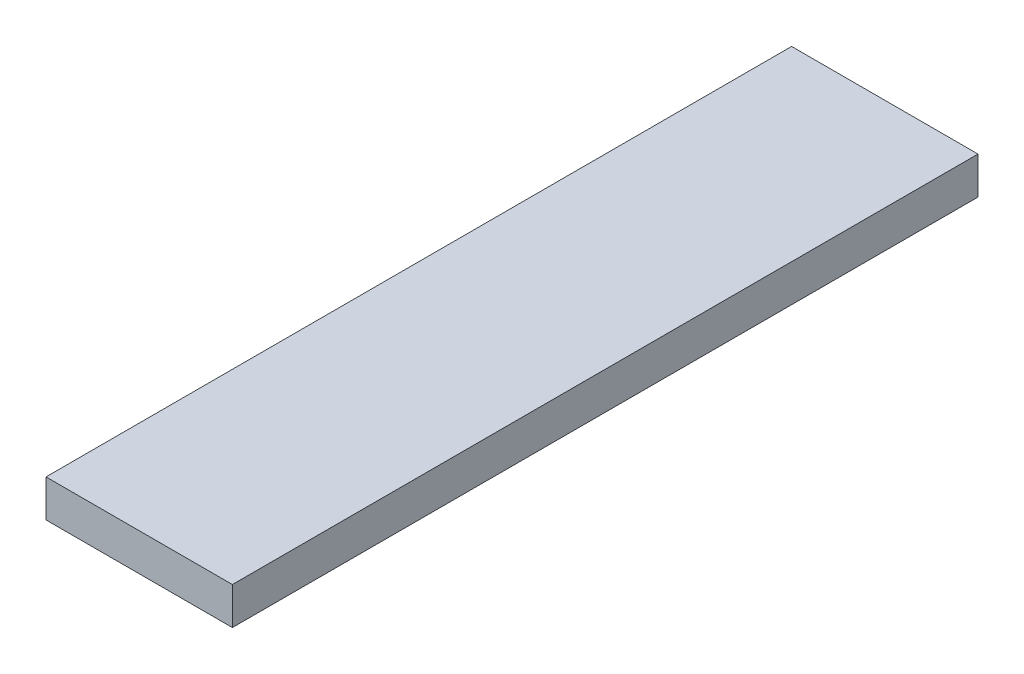
ISO-10303-21;
HEADER;
FILE_DESCRIPTION(('STEP AP214'),'2;1');
FILE_NAME('part.step','',(''),(''),'','','');
FILE_SCHEMA(('AUTOMOTIVE_DESIGN { 1 0 10303 214 1 1 1 1 }'));
ENDSEC;
DATA;
#1=APPLICATION_CONTEXT('core data for automotive mechanical design processes');
#2=APPLICATION_PROTOCOL_DEFINITION('international standard','automotive_design',2000,#1);
#3=PRODUCT_CONTEXT('',#1,'mechanical');
#4=PRODUCT('Part','Part','',(#3));
#5=PRODUCT_RELATED_PRODUCT_CATEGORY('part','',(#4));
#6=PRODUCT_DEFINITION_FORMATION('','',#4);
#7=PRODUCT_DEFINITION_CONTEXT('part definition',#1,'design');
#8=PRODUCT_DEFINITION('design','',#6,#7);
#9=PRODUCT_DEFINITION_SHAPE('','',#8);
#10=(LENGTH_UNIT() NAMED_UNIT(*) SI_UNIT(.MILLI.,.METRE.));
#11=(NAMED_UNIT(*) PLANE_ANGLE_UNIT() SI_UNIT($,.RADIAN.));
#12=(NAMED_UNIT(*) SI_UNIT($,.STERADIAN.) SOLID_ANGLE_UNIT());
#13=UNCERTAINTY_MEASURE_WITH_UNIT(LENGTH_MEASURE(1.E-05),#10,'distance_accuracy_value','');
#14=(GEOMETRIC_REPRESENTATION_CONTEXT(3) GLOBAL_UNCERTAINTY_ASSIGNED_CONTEXT((#13)) GLOBAL_UNIT_ASSIGNED_CONTEXT((#10,
#11,#12)) REPRESENTATION_CONTEXT('',''));
#15=CARTESIAN_POINT('',(0.,0.,0.));
#16=DIRECTION('',(0.,0.,1.));
#17=DIRECTION('',(1.,0.,0.));
#18=AXIS2_PLACEMENT_3D('',#15,#16,#17);
#19=CARTESIAN_POINT('',(5.,2.,-20.));
#20=DIRECTION('',(-1.,0.,0.));
#21=DIRECTION('',(0.,0.,1.));
#22=AXIS2_PLACEMENT_3D('',#19,#20,#21);
#23=PLANE('',#22);
#24=DIRECTION('',(0.,0.,-1.));
#25=VECTOR('',#24,1.);
#26=CARTESIAN_POINT('',(5.,0.,-20.));
#27=LINE('',#26,#25);
#28=CARTESIAN_POINT('',(5.,0.,20.));
#29=VERTEX_POINT('',#28);
#30=CARTESIAN_POINT('',(5.,0.,-20.));
#31=VERTEX_POINT('',#30);
#32=EDGE_CURVE('E102',#29,#31,#27,.T.);
#33=ORIENTED_EDGE('',*,*,#32,.T.);
#34=DIRECTION('',(0.,-1.,0.));
#35=VECTOR('',#34,1.);
#36=CARTESIAN_POINT('',(5.,2.,-20.));
#37=LINE('',#36,#35);
#38=CARTESIAN_POINT('',(5.,2.,-20.));
#39=VERTEX_POINT('',#38);
#40=EDGE_CURVE('E11',#39,#31,#37,.T.);
#41=ORIENTED_EDGE('',*,*,#40,.F.);
#42=DIRECTION('',(0.,0.,-1.));
#43=VECTOR('',#42,1.);
#44=CARTESIAN_POINT('',(5.,2.,-20.));
#45=LINE('',#44,#43);
#46=CARTESIAN_POINT('',(5.,2.,20.));
#47=VERTEX_POINT('',#46);
#48=EDGE_CURVE('E90',#47,#39,#45,.T.);
#49=ORIENTED_EDGE('',*,*,#48,.F.);
#50=DIRECTION('',(0.,-1.,0.));
#51=VECTOR('',#50,1.);
#52=CARTESIAN_POINT('',(5.,2.,20.));
#53=LINE('',#52,#51);
#54=EDGE_CURVE('E98',#47,#29,#53,.T.);
#55=ORIENTED_EDGE('',*,*,#54,.T.);
#56=EDGE_LOOP('',(#33,#41,#49,#55));
#57=FACE_BOUND('',#56,.T.);
#58=ADVANCED_FACE('F39',(#57),#23,.F.);
#59=CARTESIAN_POINT('',(-5.,2.,-20.));
#60=DIRECTION('',(0.,0.,1.));
#61=DIRECTION('',(1.,0.,0.));
#62=AXIS2_PLACEMENT_3D('',#59,#60,#61);
#63=PLANE('',#62);
#64=DIRECTION('',(-1.,0.,0.));
#65=VECTOR('',#64,1.);
#66=CARTESIAN_POINT('',(-5.,0.,-20.));
#67=LINE('',#66,#65);
#68=CARTESIAN_POINT('',(-5.,0.,-20.));
#69=VERTEX_POINT('',#68);
#70=EDGE_CURVE('E94',#31,#69,#67,.T.);
#71=ORIENTED_EDGE('',*,*,#70,.T.);
#72=DIRECTION('',(0.,-1.,0.));
#73=VECTOR('',#72,1.);
#74=CARTESIAN_POINT('',(-5.,2.,-20.));
#75=LINE('',#74,#73);
#76=CARTESIAN_POINT('',(-5.,2.,-20.));
#77=VERTEX_POINT('',#76);
#78=EDGE_CURVE('E47',#77,#69,#75,.T.);
#79=ORIENTED_EDGE('',*,*,#78,.F.);
#80=DIRECTION('',(-1.,0.,0.));
#81=VECTOR('',#80,1.);
#82=CARTESIAN_POINT('',(-5.,2.,-20.));
#83=LINE('',#82,#81);
#84=EDGE_CURVE('E85',#39,#77,#83,.T.);
#85=ORIENTED_EDGE('',*,*,#84,.F.);
#86=ORIENTED_EDGE('',*,*,#40,.T.);
#87=EDGE_LOOP('',(#71,#79,#85,#86));
#88=FACE_BOUND('',#87,.T.);
#89=ADVANCED_FACE('F93',(#88),#63,.F.);
#90=CARTESIAN_POINT('',(-5.,2.,-20.));
#91=DIRECTION('',(1.,0.,0.));
#92=DIRECTION('',(0.,0.,-1.));
#93=AXIS2_PLACEMENT_3D('',#90,#91,#92);
#94=PLANE('',#93);
#95=DIRECTION('',(0.,0.,1.));
#96=VECTOR('',#95,1.);
#97=CARTESIAN_POINT('',(-5.,0.,-20.));
#98=LINE('',#97,#96);
#99=CARTESIAN_POINT('',(-5.,0.,20.));
#100=VERTEX_POINT('',#99);
#101=EDGE_CURVE('E72',#69,#100,#98,.T.);
#102=ORIENTED_EDGE('',*,*,#101,.T.);
#103=DIRECTION('',(0.,-1.,0.));
#104=VECTOR('',#103,1.);
#105=CARTESIAN_POINT('',(-5.,2.,20.));
#106=LINE('',#105,#104);
#107=CARTESIAN_POINT('',(-5.,2.,20.));
#108=VERTEX_POINT('',#107);
#109=EDGE_CURVE('E95',#108,#100,#106,.T.);
#110=ORIENTED_EDGE('',*,*,#109,.F.);
#111=DIRECTION('',(0.,0.,1.));
#112=VECTOR('',#111,1.);
#113=CARTESIAN_POINT('',(-5.,2.,-20.));
#114=LINE('',#113,#112);
#115=EDGE_CURVE('E88',#77,#108,#114,.T.);
#116=ORIENTED_EDGE('',*,*,#115,.F.);
#117=ORIENTED_EDGE('',*,*,#78,.T.);
#118=EDGE_LOOP('',(#102,#110,#116,#117));
#119=FACE_BOUND('',#118,.T.);
#120=ADVANCED_FACE('F96',(#119),#94,.F.);
#121=CARTESIAN_POINT('',(-5.,2.,20.));
#122=DIRECTION('',(0.,0.,-1.));
#123=DIRECTION('',(-1.,0.,0.));
#124=AXIS2_PLACEMENT_3D('',#121,#122,#123);
#125=PLANE('',#124);
#126=DIRECTION('',(1.,0.,0.));
#127=VECTOR('',#126,1.);
#128=CARTESIAN_POINT('',(-5.,0.,20.));
#129=LINE('',#128,#127);
#130=EDGE_CURVE('E78',#100,#29,#129,.T.);
#131=ORIENTED_EDGE('',*,*,#130,.T.);
#132=ORIENTED_EDGE('',*,*,#54,.F.);
#133=DIRECTION('',(1.,0.,0.));
#134=VECTOR('',#133,1.);
#135=CARTESIAN_POINT('',(-5.,2.,20.));
#136=LINE('',#135,#134);
#137=EDGE_CURVE('E55',#108,#47,#136,.T.);
#138=ORIENTED_EDGE('',*,*,#137,.F.);
#139=ORIENTED_EDGE('',*,*,#109,.T.);
#140=EDGE_LOOP('',(#131,#132,#138,#139));
#141=FACE_BOUND('',#140,.T.);
#142=ADVANCED_FACE('F109',(#141),#125,.F.);
#143=CARTESIAN_POINT('',(0.,2.,0.));
#144=DIRECTION('',(0.,1.,0.));
#145=DIRECTION('',(0.,0.,1.));
#146=AXIS2_PLACEMENT_3D('',#143,#144,#145);
#147=PLANE('',#146);
#148=ORIENTED_EDGE('',*,*,#48,.T.);
#149=ORIENTED_EDGE('',*,*,#84,.T.);
#150=ORIENTED_EDGE('',*,*,#115,.T.);
#151=ORIENTED_EDGE('',*,*,#137,.T.);
#152=EDGE_LOOP('',(#148,#149,#150,#151));
#153=FACE_BOUND('',#152,.T.);
#154=ADVANCED_FACE('F86',(#153),#147,.T.);
#155=CARTESIAN_POINT('',(0.,0.,0.));
#156=DIRECTION('',(0.,1.,0.));
#157=DIRECTION('',(0.,0.,1.));
#158=AXIS2_PLACEMENT_3D('',#155,#156,#157);
#159=PLANE('',#158);
#160=ORIENTED_EDGE('',*,*,#32,.F.);
#161=ORIENTED_EDGE('',*,*,#130,.F.);
#162=ORIENTED_EDGE('',*,*,#101,.F.);
#163=ORIENTED_EDGE('',*,*,#70,.F.);
#164=EDGE_LOOP('',(#160,#161,#162,#163));
#165=FACE_BOUND('',#164,.T.);
#166=ADVANCED_FACE('F112',(#165),#159,.F.);
#167=CLOSED_SHELL('',(#58,#89,#120,#142,#154,#166));
#168=MANIFOLD_SOLID_BREP('B2',#167);
#169=ADVANCED_BREP_SHAPE_REPRESENTATION('',(#18,#168),#14);
#170=SHAPE_DEFINITION_REPRESENTATION(#9,#169);
ENDSEC;
END-ISO-10303-21;
